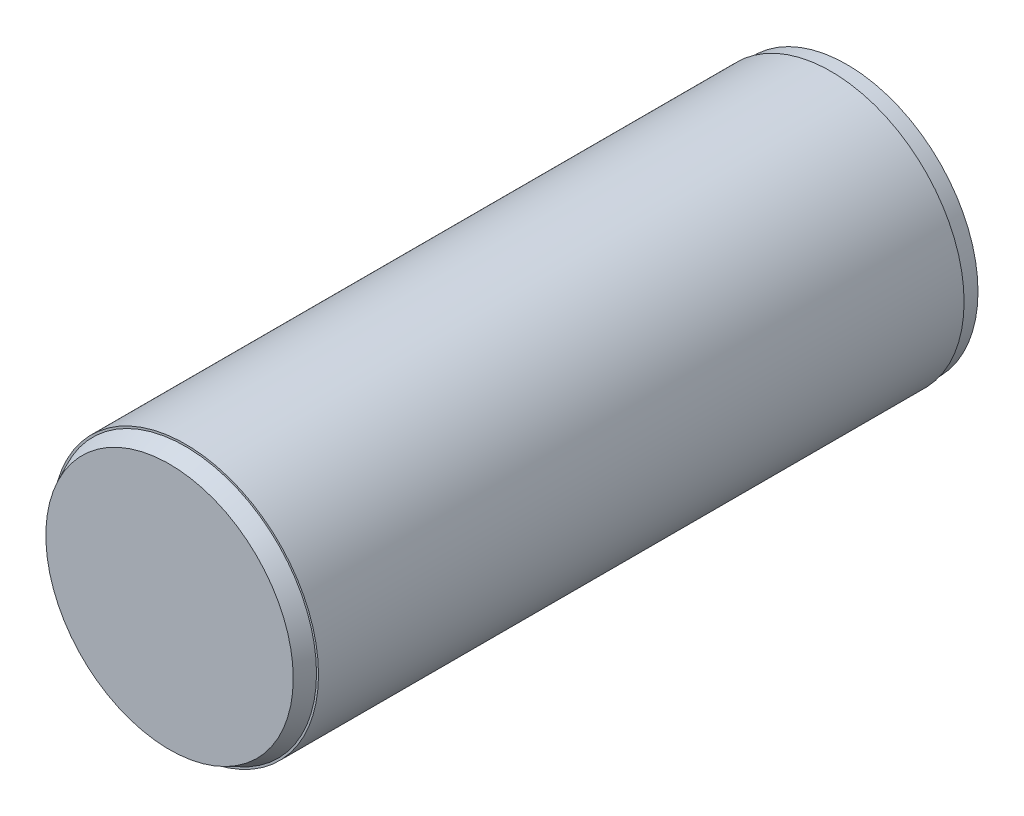
ISO-10303-21;
HEADER;
FILE_DESCRIPTION(('STEP AP214'),'2;1');
FILE_NAME('part.step','',(''),(''),'','','');
FILE_SCHEMA(('AUTOMOTIVE_DESIGN { 1 0 10303 214 1 1 1 1 }'));
ENDSEC;
DATA;
#1=APPLICATION_CONTEXT('core data for automotive mechanical design processes');
#2=APPLICATION_PROTOCOL_DEFINITION('international standard','automotive_design',2000,#1);
#3=PRODUCT_CONTEXT('',#1,'mechanical');
#4=PRODUCT('Part','Part','',(#3));
#5=PRODUCT_RELATED_PRODUCT_CATEGORY('part','',(#4));
#6=PRODUCT_DEFINITION_FORMATION('','',#4);
#7=PRODUCT_DEFINITION_CONTEXT('part definition',#1,'design');
#8=PRODUCT_DEFINITION('design','',#6,#7);
#9=PRODUCT_DEFINITION_SHAPE('','',#8);
#10=(LENGTH_UNIT() NAMED_UNIT(*) SI_UNIT(.MILLI.,.METRE.));
#11=(NAMED_UNIT(*) PLANE_ANGLE_UNIT() SI_UNIT($,.RADIAN.));
#12=(NAMED_UNIT(*) SI_UNIT($,.STERADIAN.) SOLID_ANGLE_UNIT());
#13=UNCERTAINTY_MEASURE_WITH_UNIT(LENGTH_MEASURE(1.E-05),#10,'distance_accuracy_value','');
#14=(GEOMETRIC_REPRESENTATION_CONTEXT(3) GLOBAL_UNCERTAINTY_ASSIGNED_CONTEXT((#13)) GLOBAL_UNIT_ASSIGNED_CONTEXT((#10,
#11,#12)) REPRESENTATION_CONTEXT('',''));
#15=CARTESIAN_POINT('',(0.,0.,0.));
#16=DIRECTION('',(0.,0.,1.));
#17=DIRECTION('',(1.,0.,0.));
#18=AXIS2_PLACEMENT_3D('',#15,#16,#17);
#19=CARTESIAN_POINT('',(0.,0.,0.));
#20=DIRECTION('',(0.,0.,1.));
#21=DIRECTION('',(1.,0.,0.));
#22=AXIS2_PLACEMENT_3D('',#19,#20,#21);
#23=PLANE('',#22);
#24=CARTESIAN_POINT('',(0.,0.,0.));
#25=DIRECTION('',(0.,0.,1.));
#26=DIRECTION('',(1.,0.,0.));
#27=AXIS2_PLACEMENT_3D('',#24,#25,#26);
#28=CIRCLE('',#27,5105.4);
#29=CARTESIAN_POINT('',(5105.4,0.,0.));
#30=VERTEX_POINT('',#29);
#31=EDGE_CURVE('E46',#30,#30,#28,.T.);
#32=ORIENTED_EDGE('',*,*,#31,.F.);
#33=EDGE_LOOP('',(#32));
#34=FACE_BOUND('',#33,.T.);
#35=CARTESIAN_POINT('',(0.,0.,0.));
#36=DIRECTION('',(0.,0.,1.));
#37=DIRECTION('',(1.,0.,0.));
#38=AXIS2_PLACEMENT_3D('',#35,#36,#37);
#39=CIRCLE('',#38,5029.2);
#40=CARTESIAN_POINT('',(5029.2,0.,0.));
#41=VERTEX_POINT('',#40);
#42=EDGE_CURVE('E10',#41,#41,#39,.F.);
#43=ORIENTED_EDGE('',*,*,#42,.F.);
#44=EDGE_LOOP('',(#43));
#45=FACE_BOUND('',#44,.T.);
#46=ADVANCED_FACE('F34',(#34,#45),#23,.F.);
#47=CARTESIAN_POINT('',(0.,0.,24765.));
#48=DIRECTION('',(0.,0.,1.));
#49=DIRECTION('',(1.,0.,0.));
#50=AXIS2_PLACEMENT_3D('',#47,#48,#49);
#51=PLANE('',#50);
#52=CARTESIAN_POINT('',(0.,0.,24765.));
#53=DIRECTION('',(0.,0.,1.));
#54=DIRECTION('',(1.,0.,0.));
#55=AXIS2_PLACEMENT_3D('',#52,#53,#54);
#56=CIRCLE('',#55,5105.4);
#57=CARTESIAN_POINT('',(5105.4,0.,24765.));
#58=VERTEX_POINT('',#57);
#59=EDGE_CURVE('E55',#58,#58,#56,.T.);
#60=ORIENTED_EDGE('',*,*,#59,.T.);
#61=EDGE_LOOP('',(#60));
#62=FACE_BOUND('',#61,.T.);
#63=CARTESIAN_POINT('',(0.,0.,24765.));
#64=DIRECTION('',(0.,0.,1.));
#65=DIRECTION('',(1.,0.,0.));
#66=AXIS2_PLACEMENT_3D('',#63,#64,#65);
#67=CIRCLE('',#66,5029.2);
#68=CARTESIAN_POINT('',(5029.2,0.,24765.));
#69=VERTEX_POINT('',#68);
#70=EDGE_CURVE('E61',#69,#69,#67,.T.);
#71=ORIENTED_EDGE('',*,*,#70,.F.);
#72=EDGE_LOOP('',(#71));
#73=FACE_BOUND('',#72,.T.);
#74=ADVANCED_FACE('F94',(#62,#73),#51,.T.);
#75=CARTESIAN_POINT('',(0.,0.,50.8));
#76=DIRECTION('',(0.,0.,-1.));
#77=DIRECTION('',(-1.,0.,0.));
#78=AXIS2_PLACEMENT_3D('',#75,#76,#77);
#79=CYLINDRICAL_SURFACE('',#78,5105.4);
#80=ORIENTED_EDGE('',*,*,#31,.T.);
#81=EDGE_LOOP('',(#80));
#82=FACE_BOUND('',#81,.T.);
#83=ORIENTED_EDGE('',*,*,#59,.F.);
#84=EDGE_LOOP('',(#83));
#85=FACE_BOUND('',#84,.T.);
#86=ADVANCED_FACE('F36',(#82,#85),#79,.T.);
#87=CARTESIAN_POINT('',(0.,0.,24765.));
#88=DIRECTION('',(0.,0.,-1.));
#89=DIRECTION('',(1.,0.,0.));
#90=AXIS2_PLACEMENT_3D('',#87,#88,#89);
#91=CONICAL_SURFACE('',#90,5029.2,0.436332312998583);
#92=CARTESIAN_POINT('',(0.,0.,25374.6));
#93=DIRECTION('',(0.,0.,1.));
#94=DIRECTION('',(1.,0.,0.));
#95=AXIS2_PLACEMENT_3D('',#92,#93,#94);
#96=CIRCLE('',#95,4744.93885158871);
#97=CARTESIAN_POINT('',(4744.93885158871,0.,25374.6));
#98=VERTEX_POINT('',#97);
#99=EDGE_CURVE('E58',#98,#98,#96,.T.);
#100=ORIENTED_EDGE('',*,*,#99,.F.);
#101=EDGE_LOOP('',(#100));
#102=FACE_BOUND('',#101,.T.);
#103=ORIENTED_EDGE('',*,*,#70,.T.);
#104=EDGE_LOOP('',(#103));
#105=FACE_BOUND('',#104,.T.);
#106=ADVANCED_FACE('F89',(#102,#105),#91,.T.);
#107=CARTESIAN_POINT('',(0.,0.,25374.6));
#108=DIRECTION('',(0.,0.,1.));
#109=DIRECTION('',(1.,0.,0.));
#110=AXIS2_PLACEMENT_3D('',#107,#108,#109);
#111=PLANE('',#110);
#112=ORIENTED_EDGE('',*,*,#99,.T.);
#113=EDGE_LOOP('',(#112));
#114=FACE_BOUND('',#113,.T.);
#115=ADVANCED_FACE('F80',(#114),#111,.T.);
#116=CARTESIAN_POINT('',(0.,0.,-609.6));
#117=DIRECTION('',(0.,0.,-1.));
#118=DIRECTION('',(-1.,0.,0.));
#119=AXIS2_PLACEMENT_3D('',#116,#117,#118);
#120=PLANE('',#119);
#121=CARTESIAN_POINT('',(0.,0.,-609.6));
#122=DIRECTION('',(0.,0.,-1.));
#123=DIRECTION('',(-1.,0.,0.));
#124=AXIS2_PLACEMENT_3D('',#121,#122,#123);
#125=CIRCLE('',#124,5029.2);
#126=CARTESIAN_POINT('',(5029.2,0.,-609.6));
#127=VERTEX_POINT('',#126);
#128=EDGE_CURVE('E64',#127,#127,#125,.T.);
#129=ORIENTED_EDGE('',*,*,#128,.T.);
#130=EDGE_LOOP('',(#129));
#131=FACE_BOUND('',#130,.T.);
#132=CARTESIAN_POINT('',(0.,0.,-609.6));
#133=DIRECTION('',(0.,0.,-1.));
#134=DIRECTION('',(-1.,0.,0.));
#135=AXIS2_PLACEMENT_3D('',#132,#133,#134);
#136=CIRCLE('',#135,4876.8);
#137=CARTESIAN_POINT('',(4876.8,0.,-609.6));
#138=VERTEX_POINT('',#137);
#139=EDGE_CURVE('E67',#138,#138,#136,.T.);
#140=ORIENTED_EDGE('',*,*,#139,.F.);
#141=EDGE_LOOP('',(#140));
#142=FACE_BOUND('',#141,.T.);
#143=ADVANCED_FACE('F77',(#131,#142),#120,.T.);
#144=CARTESIAN_POINT('',(0.,0.,-609.6));
#145=DIRECTION('',(0.,0.,1.));
#146=DIRECTION('',(1.,0.,0.));
#147=AXIS2_PLACEMENT_3D('',#144,#145,#146);
#148=CYLINDRICAL_SURFACE('',#147,5029.2);
#149=CARTESIAN_POINT('',(5029.2,0.,-609.6));
#150=CARTESIAN_POINT('',(5029.2,0.,-603.25));
#151=CARTESIAN_POINT('',(5029.2,0.,-596.9));
#152=CARTESIAN_POINT('',(5029.2,0.,-584.2));
#153=CARTESIAN_POINT('',(5029.2,0.,-577.85));
#154=CARTESIAN_POINT('',(5029.2,0.,-565.15));
#155=CARTESIAN_POINT('',(5029.2,0.,-558.8));
#156=CARTESIAN_POINT('',(5029.2,0.,-546.1));
#157=CARTESIAN_POINT('',(5029.2,0.,-539.75));
#158=CARTESIAN_POINT('',(5029.2,0.,-527.05));
#159=CARTESIAN_POINT('',(5029.2,0.,-520.7));
#160=CARTESIAN_POINT('',(5029.2,0.,-508.));
#161=CARTESIAN_POINT('',(5029.2,0.,-501.65));
#162=CARTESIAN_POINT('',(5029.2,0.,-488.95));
#163=CARTESIAN_POINT('',(5029.2,0.,-482.6));
#164=CARTESIAN_POINT('',(5029.2,0.,-469.9));
#165=CARTESIAN_POINT('',(5029.2,0.,-463.55));
#166=CARTESIAN_POINT('',(5029.2,0.,-450.85));
#167=CARTESIAN_POINT('',(5029.2,0.,-444.5));
#168=CARTESIAN_POINT('',(5029.2,0.,-431.8));
#169=CARTESIAN_POINT('',(5029.2,0.,-425.45));
#170=CARTESIAN_POINT('',(5029.2,0.,-412.75));
#171=CARTESIAN_POINT('',(5029.2,0.,-406.4));
#172=CARTESIAN_POINT('',(5029.2,0.,-393.7));
#173=CARTESIAN_POINT('',(5029.2,0.,-387.35));
#174=CARTESIAN_POINT('',(5029.2,0.,-374.65));
#175=CARTESIAN_POINT('',(5029.2,0.,-368.3));
#176=CARTESIAN_POINT('',(5029.2,0.,-355.6));
#177=CARTESIAN_POINT('',(5029.2,0.,-349.25));
#178=CARTESIAN_POINT('',(5029.2,0.,-336.55));
#179=CARTESIAN_POINT('',(5029.2,0.,-330.2));
#180=CARTESIAN_POINT('',(5029.2,0.,-317.5));
#181=CARTESIAN_POINT('',(5029.2,0.,-311.15));
#182=CARTESIAN_POINT('',(5029.2,0.,-298.45));
#183=CARTESIAN_POINT('',(5029.2,0.,-292.1));
#184=CARTESIAN_POINT('',(5029.2,0.,-279.4));
#185=CARTESIAN_POINT('',(5029.2,0.,-273.05));
#186=CARTESIAN_POINT('',(5029.2,0.,-260.35));
#187=CARTESIAN_POINT('',(5029.2,0.,-254.));
#188=CARTESIAN_POINT('',(5029.2,0.,-241.3));
#189=CARTESIAN_POINT('',(5029.2,0.,-234.95));
#190=CARTESIAN_POINT('',(5029.2,0.,-222.25));
#191=CARTESIAN_POINT('',(5029.2,0.,-215.9));
#192=CARTESIAN_POINT('',(5029.2,0.,-203.2));
#193=CARTESIAN_POINT('',(5029.2,0.,-196.85));
#194=CARTESIAN_POINT('',(5029.2,0.,-184.15));
#195=CARTESIAN_POINT('',(5029.2,0.,-177.8));
#196=CARTESIAN_POINT('',(5029.2,0.,-165.1));
#197=CARTESIAN_POINT('',(5029.2,0.,-158.75));
#198=CARTESIAN_POINT('',(5029.2,0.,-146.05));
#199=CARTESIAN_POINT('',(5029.2,0.,-139.7));
#200=CARTESIAN_POINT('',(5029.2,0.,-127.));
#201=CARTESIAN_POINT('',(5029.2,0.,-120.65));
#202=CARTESIAN_POINT('',(5029.2,0.,-107.95));
#203=CARTESIAN_POINT('',(5029.2,0.,-101.6));
#204=CARTESIAN_POINT('',(5029.2,0.,-88.9));
#205=CARTESIAN_POINT('',(5029.2,0.,-82.5500000000001));
#206=CARTESIAN_POINT('',(5029.2,0.,-69.85));
#207=CARTESIAN_POINT('',(5029.2,0.,-63.5));
#208=CARTESIAN_POINT('',(5029.2,0.,-50.8));
#209=CARTESIAN_POINT('',(5029.2,0.,-44.45));
#210=CARTESIAN_POINT('',(5029.2,0.,-31.75));
#211=CARTESIAN_POINT('',(5029.2,0.,-25.4));
#212=CARTESIAN_POINT('',(5029.2,0.,-12.7));
#213=CARTESIAN_POINT('',(5029.2,0.,-6.35000000000001));
#214=CARTESIAN_POINT('',(5029.2,0.,0.));
#215=B_SPLINE_CURVE_WITH_KNOTS('',3,(#149,#150,#151,#152,#153,#154,#155,#156,#157,#158,#159,
#160,#161,#162,#163,#164,#165,#166,#167,#168,#169,#170,#171,#172,#173,#174,#175,#176,#177,#178,
#179,#180,#181,#182,#183,#184,#185,#186,#187,#188,#189,#190,#191,#192,#193,#194,#195,#196,#197,
#198,#199,#200,#201,#202,#203,#204,#205,#206,#207,#208,#209,#210,#211,#212,#213,#214),
.UNSPECIFIED.,.F.,.F.,(4,2,2,2,2,2,2,2,2,2,2,2,2,2,2,2,2,2,2,2,2,2,2,2,2,2,2,2,2,2,2,2,4),(0.,
19.05,38.1,57.15,76.2,95.2500000000001,114.3,133.35,152.4,171.45,190.5,209.55,228.6,247.65,
266.7,285.75,304.8,323.85,342.9,361.95,381.,400.05,419.1,438.15,457.2,476.25,495.3,514.35,533.4,
552.45,571.5,590.55,609.6),.UNSPECIFIED.);
#216=EDGE_CURVE('BSEAM79',#127,#41,#215,.T.);
#217=ORIENTED_EDGE('',*,*,#128,.F.);
#218=ORIENTED_EDGE('',*,*,#42,.T.);
#219=ORIENTED_EDGE('',*,*,#216,.T.);
#220=ORIENTED_EDGE('',*,*,#216,.F.);
#221=EDGE_LOOP('',(#217,#219,#218,#220));
#222=FACE_BOUND('',#221,.T.);
#223=ADVANCED_FACE('F79',(#222),#148,.T.);
#224=CARTESIAN_POINT('',(0.,0.,-609.6));
#225=DIRECTION('',(0.,0.,1.));
#226=DIRECTION('',(1.,0.,0.));
#227=AXIS2_PLACEMENT_3D('',#224,#225,#226);
#228=CYLINDRICAL_SURFACE('',#227,4876.8);
#229=CARTESIAN_POINT('',(0.,0.,0.));
#230=DIRECTION('',(0.,0.,-1.));
#231=DIRECTION('',(-1.,0.,0.));
#232=AXIS2_PLACEMENT_3D('',#229,#230,#231);
#233=CIRCLE('',#232,4876.8);
#234=CARTESIAN_POINT('',(4876.8,0.,0.));
#235=VERTEX_POINT('',#234);
#236=EDGE_CURVE('E68',#235,#235,#233,.T.);
#237=CARTESIAN_POINT('',(4876.8,0.,-609.6));
#238=CARTESIAN_POINT('',(4876.8,0.,-603.25));
#239=CARTESIAN_POINT('',(4876.8,0.,-596.9));
#240=CARTESIAN_POINT('',(4876.8,0.,-584.2));
#241=CARTESIAN_POINT('',(4876.8,0.,-577.85));
#242=CARTESIAN_POINT('',(4876.8,0.,-565.15));
#243=CARTESIAN_POINT('',(4876.8,0.,-558.8));
#244=CARTESIAN_POINT('',(4876.8,0.,-546.1));
#245=CARTESIAN_POINT('',(4876.8,0.,-539.75));
#246=CARTESIAN_POINT('',(4876.8,0.,-527.05));
#247=CARTESIAN_POINT('',(4876.8,0.,-520.7));
#248=CARTESIAN_POINT('',(4876.8,0.,-508.));
#249=CARTESIAN_POINT('',(4876.8,0.,-501.65));
#250=CARTESIAN_POINT('',(4876.8,0.,-488.95));
#251=CARTESIAN_POINT('',(4876.8,0.,-482.6));
#252=CARTESIAN_POINT('',(4876.8,0.,-469.9));
#253=CARTESIAN_POINT('',(4876.8,0.,-463.55));
#254=CARTESIAN_POINT('',(4876.8,0.,-450.85));
#255=CARTESIAN_POINT('',(4876.8,0.,-444.5));
#256=CARTESIAN_POINT('',(4876.8,0.,-431.8));
#257=CARTESIAN_POINT('',(4876.8,0.,-425.45));
#258=CARTESIAN_POINT('',(4876.8,0.,-412.75));
#259=CARTESIAN_POINT('',(4876.8,0.,-406.4));
#260=CARTESIAN_POINT('',(4876.8,0.,-393.7));
#261=CARTESIAN_POINT('',(4876.8,0.,-387.35));
#262=CARTESIAN_POINT('',(4876.8,0.,-374.65));
#263=CARTESIAN_POINT('',(4876.8,0.,-368.3));
#264=CARTESIAN_POINT('',(4876.8,0.,-355.6));
#265=CARTESIAN_POINT('',(4876.8,0.,-349.25));
#266=CARTESIAN_POINT('',(4876.8,0.,-336.55));
#267=CARTESIAN_POINT('',(4876.8,0.,-330.2));
#268=CARTESIAN_POINT('',(4876.8,0.,-317.5));
#269=CARTESIAN_POINT('',(4876.8,0.,-311.15));
#270=CARTESIAN_POINT('',(4876.8,0.,-298.45));
#271=CARTESIAN_POINT('',(4876.8,0.,-292.1));
#272=CARTESIAN_POINT('',(4876.8,0.,-279.4));
#273=CARTESIAN_POINT('',(4876.8,0.,-273.05));
#274=CARTESIAN_POINT('',(4876.8,0.,-260.35));
#275=CARTESIAN_POINT('',(4876.8,0.,-254.));
#276=CARTESIAN_POINT('',(4876.8,0.,-241.3));
#277=CARTESIAN_POINT('',(4876.8,0.,-234.95));
#278=CARTESIAN_POINT('',(4876.8,0.,-222.25));
#279=CARTESIAN_POINT('',(4876.8,0.,-215.9));
#280=CARTESIAN_POINT('',(4876.8,0.,-203.2));
#281=CARTESIAN_POINT('',(4876.8,0.,-196.85));
#282=CARTESIAN_POINT('',(4876.8,0.,-184.15));
#283=CARTESIAN_POINT('',(4876.8,0.,-177.8));
#284=CARTESIAN_POINT('',(4876.8,0.,-165.1));
#285=CARTESIAN_POINT('',(4876.8,0.,-158.75));
#286=CARTESIAN_POINT('',(4876.8,0.,-146.05));
#287=CARTESIAN_POINT('',(4876.8,0.,-139.7));
#288=CARTESIAN_POINT('',(4876.8,0.,-127.));
#289=CARTESIAN_POINT('',(4876.8,0.,-120.65));
#290=CARTESIAN_POINT('',(4876.8,0.,-107.95));
#291=CARTESIAN_POINT('',(4876.8,0.,-101.6));
#292=CARTESIAN_POINT('',(4876.8,0.,-88.9));
#293=CARTESIAN_POINT('',(4876.8,0.,-82.5500000000001));
#294=CARTESIAN_POINT('',(4876.8,0.,-69.85));
#295=CARTESIAN_POINT('',(4876.8,0.,-63.5));
#296=CARTESIAN_POINT('',(4876.8,0.,-50.8));
#297=CARTESIAN_POINT('',(4876.8,0.,-44.45));
#298=CARTESIAN_POINT('',(4876.8,0.,-31.75));
#299=CARTESIAN_POINT('',(4876.8,0.,-25.4));
#300=CARTESIAN_POINT('',(4876.8,0.,-12.7));
#301=CARTESIAN_POINT('',(4876.8,0.,-6.35000000000001));
#302=CARTESIAN_POINT('',(4876.8,0.,0.));
#303=B_SPLINE_CURVE_WITH_KNOTS('',3,(#237,#238,#239,#240,#241,#242,#243,#244,#245,#246,#247,
#248,#249,#250,#251,#252,#253,#254,#255,#256,#257,#258,#259,#260,#261,#262,#263,#264,#265,#266,
#267,#268,#269,#270,#271,#272,#273,#274,#275,#276,#277,#278,#279,#280,#281,#282,#283,#284,#285,
#286,#287,#288,#289,#290,#291,#292,#293,#294,#295,#296,#297,#298,#299,#300,#301,#302),
.UNSPECIFIED.,.F.,.F.,(4,2,2,2,2,2,2,2,2,2,2,2,2,2,2,2,2,2,2,2,2,2,2,2,2,2,2,2,2,2,2,2,4),(0.,
19.05,38.1,57.15,76.2,95.2500000000001,114.3,133.35,152.4,171.45,190.5,209.55,228.6,247.65,
266.7,285.75,304.8,323.85,342.9,361.95,381.,400.05,419.1,438.15,457.2,476.25,495.3,514.35,533.4,
552.45,571.5,590.55,609.6),.UNSPECIFIED.);
#304=EDGE_CURVE('BSEAM74',#138,#235,#303,.T.);
#305=ORIENTED_EDGE('',*,*,#139,.T.);
#306=ORIENTED_EDGE('',*,*,#236,.F.);
#307=ORIENTED_EDGE('',*,*,#304,.T.);
#308=ORIENTED_EDGE('',*,*,#304,.F.);
#309=EDGE_LOOP('',(#305,#307,#306,#308));
#310=FACE_BOUND('',#309,.T.);
#311=ADVANCED_FACE('F74',(#310),#228,.F.);
#312=ORIENTED_EDGE('',*,*,#236,.T.);
#313=EDGE_LOOP('',(#312));
#314=FACE_BOUND('',#313,.T.);
#315=ADVANCED_FACE('F96',(#314),#23,.F.);
#316=CLOSED_SHELL('',(#46,#74,#86,#106,#115,#143,#223,#311,#315));
#317=CARTESIAN_POINT('',(0.,0.,50.8));
#318=DIRECTION('',(0.,0.,1.));
#319=DIRECTION('',(1.,0.,0.));
#320=AXIS2_PLACEMENT_3D('',#317,#318,#319);
#321=PLANE('',#320);
#322=CARTESIAN_POINT('',(0.,0.,50.7999999999988));
#323=DIRECTION('',(0.,0.,1.));
#324=DIRECTION('',(1.,0.,0.));
#325=AXIS2_PLACEMENT_3D('',#322,#323,#324);
#326=CIRCLE('',#325,5092.7);
#327=CARTESIAN_POINT('',(-5092.7,0.,50.7999999999988));
#328=VERTEX_POINT('',#327);
#329=EDGE_CURVE('E42',#328,#328,#326,.F.);
#330=ORIENTED_EDGE('',*,*,#329,.F.);
#331=EDGE_LOOP('',(#330));
#332=FACE_BOUND('',#331,.T.);
#333=ADVANCED_FACE('F177',(#332),#321,.T.);
#334=CARTESIAN_POINT('',(0.,0.,24739.6));
#335=DIRECTION('',(0.,0.,-1.));
#336=DIRECTION('',(-1.,0.,0.));
#337=AXIS2_PLACEMENT_3D('',#334,#335,#336);
#338=CYLINDRICAL_SURFACE('',#337,5092.7);
#339=CARTESIAN_POINT('',(0.,0.,24739.6));
#340=DIRECTION('',(0.,0.,1.));
#341=DIRECTION('',(1.,0.,0.));
#342=AXIS2_PLACEMENT_3D('',#339,#340,#341);
#343=CIRCLE('',#342,5092.7);
#344=CARTESIAN_POINT('',(-5092.7,0.,24739.6));
#345=VERTEX_POINT('',#344);
#346=EDGE_CURVE('E50',#345,#345,#343,.T.);
#347=CARTESIAN_POINT('',(-5092.7,0.,24739.6));
#348=CARTESIAN_POINT('',(-5092.7,0.,24482.425));
#349=CARTESIAN_POINT('',(-5092.7,0.,24225.25));
#350=CARTESIAN_POINT('',(-5092.7,0.,23710.9));
#351=CARTESIAN_POINT('',(-5092.7,0.,23453.725));
#352=CARTESIAN_POINT('',(-5092.7,0.,22939.375));
#353=CARTESIAN_POINT('',(-5092.7,0.,22682.2));
#354=CARTESIAN_POINT('',(-5092.7,0.,22167.85));
#355=CARTESIAN_POINT('',(-5092.7,0.,21910.675));
#356=CARTESIAN_POINT('',(-5092.7,0.,21396.325));
#357=CARTESIAN_POINT('',(-5092.7,0.,21139.15));
#358=CARTESIAN_POINT('',(-5092.7,0.,20624.8));
#359=CARTESIAN_POINT('',(-5092.7,0.,20367.625));
#360=CARTESIAN_POINT('',(-5092.7,0.,19853.275));
#361=CARTESIAN_POINT('',(-5092.7,0.,19596.1));
#362=CARTESIAN_POINT('',(-5092.7,0.,19081.75));
#363=CARTESIAN_POINT('',(-5092.7,0.,18824.575));
#364=CARTESIAN_POINT('',(-5092.7,0.,18310.225));
#365=CARTESIAN_POINT('',(-5092.7,0.,18053.05));
#366=CARTESIAN_POINT('',(-5092.7,0.,17538.7));
#367=CARTESIAN_POINT('',(-5092.7,0.,17281.525));
#368=CARTESIAN_POINT('',(-5092.7,0.,16767.175));
#369=CARTESIAN_POINT('',(-5092.7,0.,16510.));
#370=CARTESIAN_POINT('',(-5092.7,0.,15995.65));
#371=CARTESIAN_POINT('',(-5092.7,0.,15738.475));
#372=CARTESIAN_POINT('',(-5092.7,0.,15224.125));
#373=CARTESIAN_POINT('',(-5092.7,0.,14966.95));
#374=CARTESIAN_POINT('',(-5092.7,0.,14452.6));
#375=CARTESIAN_POINT('',(-5092.7,0.,14195.425));
#376=CARTESIAN_POINT('',(-5092.7,0.,13681.075));
#377=CARTESIAN_POINT('',(-5092.7,0.,13423.9));
#378=CARTESIAN_POINT('',(-5092.7,0.,12909.55));
#379=CARTESIAN_POINT('',(-5092.7,0.,12652.375));
#380=CARTESIAN_POINT('',(-5092.7,0.,12138.025));
#381=CARTESIAN_POINT('',(-5092.7,0.,11880.85));
#382=CARTESIAN_POINT('',(-5092.7,0.,11366.5));
#383=CARTESIAN_POINT('',(-5092.7,0.,11109.325));
#384=CARTESIAN_POINT('',(-5092.7,0.,10594.975));
#385=CARTESIAN_POINT('',(-5092.7,0.,10337.8));
#386=CARTESIAN_POINT('',(-5092.7,0.,9823.45));
#387=CARTESIAN_POINT('',(-5092.7,0.,9566.275));
#388=CARTESIAN_POINT('',(-5092.7,0.,9051.925));
#389=CARTESIAN_POINT('',(-5092.7,0.,8794.75));
#390=CARTESIAN_POINT('',(-5092.7,0.,8280.4));
#391=CARTESIAN_POINT('',(-5092.7,0.,8023.225));
#392=CARTESIAN_POINT('',(-5092.7,0.,7508.875));
#393=CARTESIAN_POINT('',(-5092.7,0.,7251.7));
#394=CARTESIAN_POINT('',(-5092.7,0.,6737.35));
#395=CARTESIAN_POINT('',(-5092.7,0.,6480.175));
#396=CARTESIAN_POINT('',(-5092.7,0.,5965.825));
#397=CARTESIAN_POINT('',(-5092.7,0.,5708.65));
#398=CARTESIAN_POINT('',(-5092.7,0.,5194.3));
#399=CARTESIAN_POINT('',(-5092.7,0.,4937.125));
#400=CARTESIAN_POINT('',(-5092.7,0.,4422.775));
#401=CARTESIAN_POINT('',(-5092.7,0.,4165.6));
#402=CARTESIAN_POINT('',(-5092.7,0.,3651.25));
#403=CARTESIAN_POINT('',(-5092.7,0.,3394.075));
#404=CARTESIAN_POINT('',(-5092.7,0.,2879.725));
#405=CARTESIAN_POINT('',(-5092.7,0.,2622.55));
#406=CARTESIAN_POINT('',(-5092.7,0.,2108.2));
#407=CARTESIAN_POINT('',(-5092.7,0.,1851.025));
#408=CARTESIAN_POINT('',(-5092.7,0.,1336.675));
#409=CARTESIAN_POINT('',(-5092.7,0.,1079.5));
#410=CARTESIAN_POINT('',(-5092.7,0.,565.149999999999));
#411=CARTESIAN_POINT('',(-5092.7,0.,307.974999999999));
#412=CARTESIAN_POINT('',(-5092.7,0.,50.7999999999988));
#413=B_SPLINE_CURVE_WITH_KNOTS('',3,(#347,#348,#349,#350,#351,#352,#353,#354,#355,#356,#357,
#358,#359,#360,#361,#362,#363,#364,#365,#366,#367,#368,#369,#370,#371,#372,#373,#374,#375,#376,
#377,#378,#379,#380,#381,#382,#383,#384,#385,#386,#387,#388,#389,#390,#391,#392,#393,#394,#395,
#396,#397,#398,#399,#400,#401,#402,#403,#404,#405,#406,#407,#408,#409,#410,#411,#412),
.UNSPECIFIED.,.F.,.F.,(4,2,2,2,2,2,2,2,2,2,2,2,2,2,2,2,2,2,2,2,2,2,2,2,2,2,2,2,2,2,2,2,4),(0.,
771.524999999997,1543.05,2314.575,3086.1,3857.625,4629.15,5400.675,6172.2,6943.725,7715.25,
8486.775,9258.3,10029.825,10801.35,11572.875,12344.4,13115.925,13887.45,14658.975,15430.5,
16202.025,16973.55,17745.075,18516.6,19288.125,20059.65,20831.175,21602.7,22374.225,23145.75,
23917.275,24688.8),.UNSPECIFIED.);
#414=EDGE_CURVE('BSEAM158',#345,#328,#413,.T.);
#415=ORIENTED_EDGE('',*,*,#346,.T.);
#416=ORIENTED_EDGE('',*,*,#329,.T.);
#417=ORIENTED_EDGE('',*,*,#414,.T.);
#418=ORIENTED_EDGE('',*,*,#414,.F.);
#419=EDGE_LOOP('',(#415,#417,#416,#418));
#420=FACE_BOUND('',#419,.T.);
#421=ADVANCED_FACE('F158',(#420),#338,.F.);
#422=CARTESIAN_POINT('',(0.,0.,24739.6));
#423=DIRECTION('',(0.,0.,1.));
#424=DIRECTION('',(1.,0.,0.));
#425=AXIS2_PLACEMENT_3D('',#422,#423,#424);
#426=PLANE('',#425);
#427=ORIENTED_EDGE('',*,*,#346,.F.);
#428=EDGE_LOOP('',(#427));
#429=FACE_BOUND('',#428,.T.);
#430=ADVANCED_FACE('F154',(#429),#426,.F.);
#431=CLOSED_SHELL('',(#333,#421,#430));
#432=ORIENTED_CLOSED_SHELL('',*,#431,.T.);
#433=BREP_WITH_VOIDS('B2',#316,(#432));
#434=ADVANCED_BREP_SHAPE_REPRESENTATION('',(#18,#433),#14);
#435=SHAPE_DEFINITION_REPRESENTATION(#9,#434);
ENDSEC;
END-ISO-10303-21;
